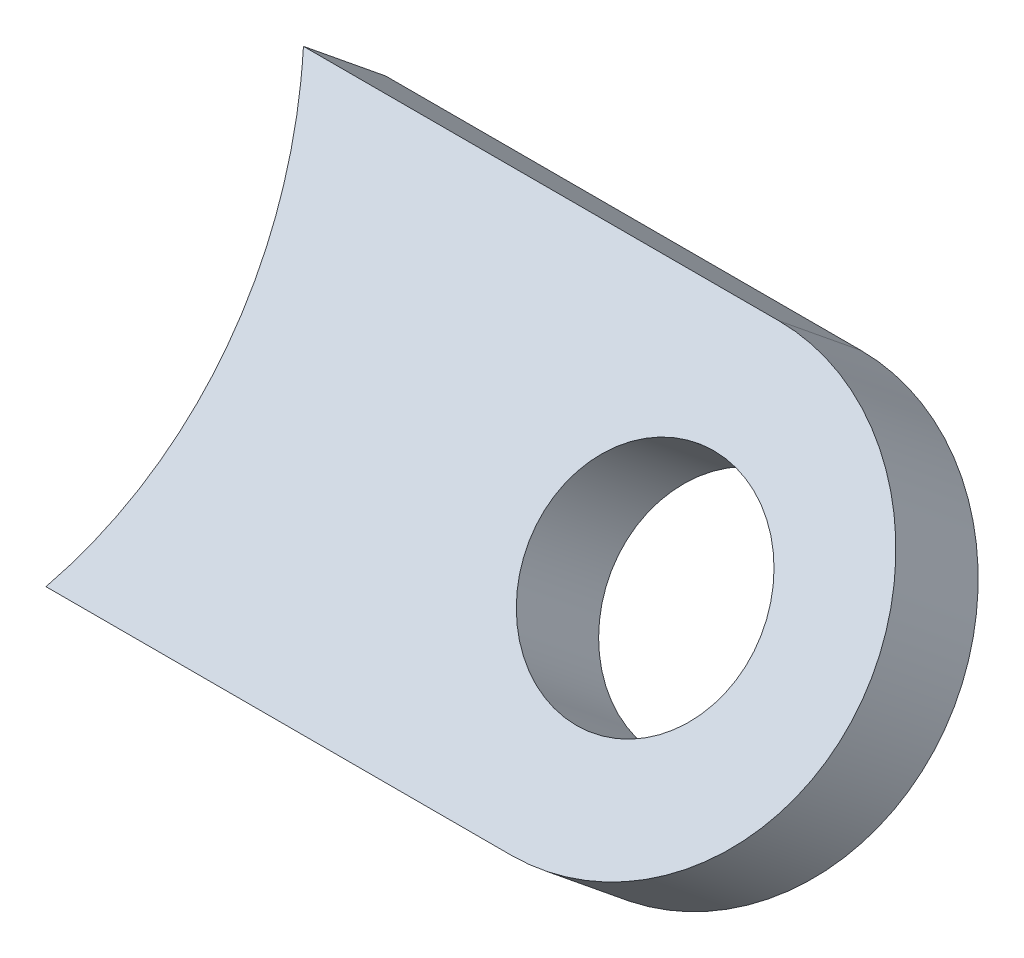
ISO-10303-21;
HEADER;
FILE_DESCRIPTION(('STEP AP214'),'2;1');
FILE_NAME('part.step','',(''),(''),'','','');
FILE_SCHEMA(('AUTOMOTIVE_DESIGN { 1 0 10303 214 1 1 1 1 }'));
ENDSEC;
DATA;
#1=APPLICATION_CONTEXT('core data for automotive mechanical design processes');
#2=APPLICATION_PROTOCOL_DEFINITION('international standard','automotive_design',2000,#1);
#3=PRODUCT_CONTEXT('',#1,'mechanical');
#4=PRODUCT('Part','Part','',(#3));
#5=PRODUCT_RELATED_PRODUCT_CATEGORY('part','',(#4));
#6=PRODUCT_DEFINITION_FORMATION('','',#4);
#7=PRODUCT_DEFINITION_CONTEXT('part definition',#1,'design');
#8=PRODUCT_DEFINITION('design','',#6,#7);
#9=PRODUCT_DEFINITION_SHAPE('','',#8);
#10=(LENGTH_UNIT() NAMED_UNIT(*) SI_UNIT(.MILLI.,.METRE.));
#11=(NAMED_UNIT(*) PLANE_ANGLE_UNIT() SI_UNIT($,.RADIAN.));
#12=(NAMED_UNIT(*) SI_UNIT($,.STERADIAN.) SOLID_ANGLE_UNIT());
#13=UNCERTAINTY_MEASURE_WITH_UNIT(LENGTH_MEASURE(1.E-05),#10,'distance_accuracy_value','');
#14=(GEOMETRIC_REPRESENTATION_CONTEXT(3) GLOBAL_UNCERTAINTY_ASSIGNED_CONTEXT((#13)) GLOBAL_UNIT_ASSIGNED_CONTEXT((#10,
#11,#12)) REPRESENTATION_CONTEXT('',''));
#15=CARTESIAN_POINT('',(0.,0.,0.));
#16=DIRECTION('',(0.,0.,1.));
#17=DIRECTION('',(1.,0.,0.));
#18=AXIS2_PLACEMENT_3D('',#15,#16,#17);
#19=CARTESIAN_POINT('',(-294.732924885388,114.1426530369,129.150880803748));
#20=DIRECTION('',(0.,-0.630511996261592,-0.776179504090531));
#21=DIRECTION('',(0.,0.776179504090531,-0.630511996261592));
#22=AXIS2_PLACEMENT_3D('',#19,#20,#21);
#23=PLANE('',#22);
#24=CARTESIAN_POINT('',(-294.732924885388,114.1426530369,129.150880803748));
#25=DIRECTION('',(0.,-0.630511996261592,-0.776179504090531));
#26=DIRECTION('',(0.,0.776179504090531,-0.630511996261592));
#27=AXIS2_PLACEMENT_3D('',#24,#25,#26);
#28=CIRCLE('',#27,3.2639);
#29=CARTESIAN_POINT('',(-294.732924885388,111.609280753499,131.208808908347));
#30=VERTEX_POINT('',#29);
#31=EDGE_CURVE('E110',#30,#30,#28,.T.);
#32=ORIENTED_EDGE('',*,*,#31,.F.);
#33=EDGE_LOOP('',(#32));
#34=FACE_BOUND('',#33,.T.);
#35=CARTESIAN_POINT('',(-308.697428246937,109.169189051724,133.190962626448));
#36=CARTESIAN_POINT('',(-308.198897948485,109.929215645387,132.573572084368));
#37=CARTESIAN_POINT('',(-307.448369839859,111.548575031029,131.258121839257));
#38=CARTESIAN_POINT('',(-307.118057965097,114.145424951657,129.14862910102));
#39=CARTESIAN_POINT('',(-307.606846343284,116.739727530974,127.041205638315));
#40=CARTESIAN_POINT('',(-308.459304269677,118.362564533561,125.722930429144));
#41=CARTESIAN_POINT('',(-309.002153819051,119.119344620465,125.108177113951));
#42=B_SPLINE_CURVE_WITH_KNOTS('',3,(#35,#36,#37,#38,#39,#40,#41),.UNSPECIFIED.,.F.,.F.,(4,1,1,1,
4),(0.751630578301676,1.00320690955254,1.25478324080341,1.50635957205427,1.75793590330514),.UNSPECIFIED.);
#43=CARTESIAN_POINT('',(-308.945663018633,119.039795742975,125.172796858845));
#44=VERTEX_POINT('',#43);
#45=CARTESIAN_POINT('',(-308.66827136486,109.213913185925,133.15463198001));
#46=VERTEX_POINT('',#45);
#47=EDGE_CURVE('E127',#44,#46,#42,.F.);
#48=ORIENTED_EDGE('',*,*,#47,.F.);
#49=CARTESIAN_POINT('',(-320.429388230365,114.818610003164,128.601782336268));
#50=DIRECTION('',(0.,-0.630511996261592,-0.776179504090531));
#51=DIRECTION('',(0.322258479400884,-0.734771659901167,0.596875263568791));
#52=AXIS2_PLACEMENT_3D('',#49,#50,#51);
#53=ELLIPSE('',#52,13.2223704151082,12.7);
#54=CARTESIAN_POINT('',(-308.964586854196,119.071392887875,125.147129627487));
#55=VERTEX_POINT('',#54);
#56=EDGE_CURVE('E121',#55,#44,#53,.T.);
#57=ORIENTED_EDGE('',*,*,#56,.F.);
#58=DIRECTION('',(1.,0.,0.));
#59=VECTOR('',#58,1.);
#60=CARTESIAN_POINT('',(-320.132924885388,119.071392887875,125.147129627487));
#61=LINE('',#60,#59);
#62=CARTESIAN_POINT('',(-294.732924885388,119.071392887875,125.147129627487));
#63=VERTEX_POINT('',#62);
#64=EDGE_CURVE('E105',#55,#63,#61,.T.);
#65=ORIENTED_EDGE('',*,*,#64,.T.);
#66=CARTESIAN_POINT('',(-294.732924885388,114.1426530369,129.150880803748));
#67=DIRECTION('',(0.,-0.630511996261592,-0.776179504090531));
#68=DIRECTION('',(0.,0.776179504090531,-0.630511996261592));
#69=AXIS2_PLACEMENT_3D('',#66,#67,#68);
#70=CIRCLE('',#69,6.34999999999999);
#71=CARTESIAN_POINT('',(-294.732924885388,109.213913185925,133.15463198001));
#72=VERTEX_POINT('',#71);
#73=EDGE_CURVE('E70',#63,#72,#70,.T.);
#74=ORIENTED_EDGE('',*,*,#73,.T.);
#75=DIRECTION('',(-1.,0.,0.));
#76=VECTOR('',#75,1.);
#77=CARTESIAN_POINT('',(-294.732924885388,109.213913185925,133.15463198001));
#78=LINE('',#77,#76);
#79=EDGE_CURVE('E100',#72,#46,#78,.T.);
#80=ORIENTED_EDGE('',*,*,#79,.T.);
#81=EDGE_LOOP('',(#48,#57,#65,#74,#80));
#82=FACE_BOUND('',#81,.T.);
#83=ADVANCED_FACE('F41',(#34,#82),#23,.T.);
#84=CARTESIAN_POINT('',(-294.732924885388,116.14452862503,131.615250729236));
#85=DIRECTION('',(0.,-0.630511996261592,-0.776179504090531));
#86=DIRECTION('',(0.,0.776179504090531,-0.630511996261592));
#87=AXIS2_PLACEMENT_3D('',#84,#85,#86);
#88=PLANE('',#87);
#89=CARTESIAN_POINT('',(-294.732924885388,116.14452862503,131.615250729236));
#90=DIRECTION('',(0.,-0.630511996261592,-0.776179504090531));
#91=DIRECTION('',(0.,0.776179504090531,-0.630511996261592));
#92=AXIS2_PLACEMENT_3D('',#89,#90,#91);
#93=CIRCLE('',#92,3.2639);
#94=CARTESIAN_POINT('',(-294.732924885388,113.611156341629,133.673178833834));
#95=VERTEX_POINT('',#94);
#96=EDGE_CURVE('E113',#95,#95,#93,.T.);
#97=ORIENTED_EDGE('',*,*,#96,.T.);
#98=EDGE_LOOP('',(#97));
#99=FACE_BOUND('',#98,.T.);
#100=DIRECTION('',(1.,0.,0.));
#101=VECTOR('',#100,1.);
#102=CARTESIAN_POINT('',(-320.132924885388,121.073268476005,127.611499552975));
#103=LINE('',#102,#101);
#104=CARTESIAN_POINT('',(-308.967965174706,121.073268476005,127.611499552975));
#105=VERTEX_POINT('',#104);
#106=CARTESIAN_POINT('',(-294.732924885388,121.073268476005,127.611499552975));
#107=VERTEX_POINT('',#106);
#108=EDGE_CURVE('E93',#105,#107,#103,.T.);
#109=ORIENTED_EDGE('',*,*,#108,.F.);
#110=CARTESIAN_POINT('',(-308.697428246937,111.171064639855,135.655332551936));
#111=CARTESIAN_POINT('',(-308.198897948485,111.931091233518,135.037942009855));
#112=CARTESIAN_POINT('',(-307.448369839859,113.55045061916,133.722491764744));
#113=CARTESIAN_POINT('',(-307.118057965097,116.147300539787,131.612999026508));
#114=CARTESIAN_POINT('',(-307.606846343284,118.741603119104,129.505575563802));
#115=CARTESIAN_POINT('',(-308.459304269677,120.364440121692,128.187300354632));
#116=CARTESIAN_POINT('',(-309.002153819051,121.121220208595,127.572547039439));
#117=B_SPLINE_CURVE_WITH_KNOTS('',3,(#110,#111,#112,#113,#114,#115,#116),.UNSPECIFIED.,.F.,.F.,
(4,1,1,1,4),(0.751630578301676,1.00320690955254,1.25478324080341,1.50635957205427,
1.75793590330514),.UNSPECIFIED.);
#118=CARTESIAN_POINT('',(-308.66827136486,111.215788774056,135.619001905497));
#119=VERTEX_POINT('',#118);
#120=EDGE_CURVE('E104',#105,#119,#117,.F.);
#121=ORIENTED_EDGE('',*,*,#120,.T.);
#122=DIRECTION('',(-1.,0.,0.));
#123=VECTOR('',#122,1.);
#124=CARTESIAN_POINT('',(-294.732924885388,111.215788774056,135.619001905497));
#125=LINE('',#124,#123);
#126=CARTESIAN_POINT('',(-294.732924885388,111.215788774056,135.619001905497));
#127=VERTEX_POINT('',#126);
#128=EDGE_CURVE('E92',#127,#119,#125,.T.);
#129=ORIENTED_EDGE('',*,*,#128,.F.);
#130=CARTESIAN_POINT('',(-294.732924885388,116.14452862503,131.615250729236));
#131=DIRECTION('',(0.,-0.630511996261592,-0.776179504090531));
#132=DIRECTION('',(0.,0.776179504090531,-0.630511996261592));
#133=AXIS2_PLACEMENT_3D('',#130,#131,#132);
#134=CIRCLE('',#133,6.34999999999999);
#135=EDGE_CURVE('E83',#107,#127,#134,.T.);
#136=ORIENTED_EDGE('',*,*,#135,.F.);
#137=EDGE_LOOP('',(#109,#121,#129,#136));
#138=FACE_BOUND('',#137,.T.);
#139=ADVANCED_FACE('F103',(#99,#138),#88,.F.);
#140=CARTESIAN_POINT('',(-320.132924885388,119.071392887875,125.147129627487));
#141=DIRECTION('',(0.,-0.776179504090531,0.630511996261592));
#142=DIRECTION('',(0.,-0.630511996261592,-0.776179504090531));
#143=AXIS2_PLACEMENT_3D('',#140,#141,#142);
#144=PLANE('',#143);
#145=CARTESIAN_POINT('',(-322.294587203653,106.476593716596,109.642547584885));
#146=DIRECTION('',(0.,-0.776179504090531,0.630511996261592));
#147=DIRECTION('',(0.0929698706276093,0.627781199916778,0.772817810474458));
#148=AXIS2_PLACEMENT_3D('',#145,#146,#147);
#149=ELLIPSE('',#148,48.2054533363894,12.7);
#150=CARTESIAN_POINT('',(-308.967965174706,119.132193620584,125.221977184461));
#151=VERTEX_POINT('',#150);
#152=EDGE_CURVE('E116',#55,#151,#149,.T.);
#153=ORIENTED_EDGE('',*,*,#152,.T.);
#154=DIRECTION('',(0.,0.630511996261592,0.776179504090531));
#155=VECTOR('',#154,1.);
#156=CARTESIAN_POINT('',(-308.967965174706,115.152597399257,120.322972819968));
#157=LINE('',#156,#155);
#158=EDGE_CURVE('E62',#151,#105,#157,.T.);
#159=ORIENTED_EDGE('',*,*,#158,.T.);
#160=ORIENTED_EDGE('',*,*,#108,.T.);
#161=DIRECTION('',(0.,0.630511996261592,0.776179504090531));
#162=VECTOR('',#161,1.);
#163=CARTESIAN_POINT('',(-294.732924885388,119.071392887875,125.147129627487));
#164=LINE('',#163,#162);
#165=EDGE_CURVE('E55',#63,#107,#164,.T.);
#166=ORIENTED_EDGE('',*,*,#165,.F.);
#167=ORIENTED_EDGE('',*,*,#64,.F.);
#168=EDGE_LOOP('',(#153,#159,#160,#166,#167));
#169=FACE_BOUND('',#168,.T.);
#170=ADVANCED_FACE('F43',(#169),#144,.F.);
#171=CARTESIAN_POINT('',(-294.732924885388,109.213913185925,133.15463198001));
#172=DIRECTION('',(0.,0.776179504090531,-0.630511996261592));
#173=DIRECTION('',(0.,0.630511996261592,0.776179504090531));
#174=AXIS2_PLACEMENT_3D('',#171,#172,#173);
#175=PLANE('',#174);
#176=ORIENTED_EDGE('',*,*,#128,.T.);
#177=DIRECTION('',(0.,0.630511996261592,0.776179504090531));
#178=VECTOR('',#177,1.);
#179=CARTESIAN_POINT('',(-308.66827136486,105.295117697307,128.330475172491));
#180=LINE('',#179,#178);
#181=EDGE_CURVE('E135',#46,#119,#180,.T.);
#182=ORIENTED_EDGE('',*,*,#181,.F.);
#183=ORIENTED_EDGE('',*,*,#79,.F.);
#184=DIRECTION('',(0.,0.630511996261592,0.776179504090531));
#185=VECTOR('',#184,1.);
#186=CARTESIAN_POINT('',(-294.732924885388,109.213913185925,133.15463198001));
#187=LINE('',#186,#185);
#188=EDGE_CURVE('E86',#72,#127,#187,.T.);
#189=ORIENTED_EDGE('',*,*,#188,.T.);
#190=EDGE_LOOP('',(#176,#182,#183,#189));
#191=FACE_BOUND('',#190,.T.);
#192=ADVANCED_FACE('F97',(#191),#175,.F.);
#193=CARTESIAN_POINT('',(-320.911078400438,112.664272958496,123.705534191892));
#194=DIRECTION('',(0.0896853848953909,0.401113742919049,0.911627279636605));
#195=DIRECTION('',(0.,-0.915315868946413,0.402736713070554));
#196=AXIS2_PLACEMENT_3D('',#193,#194,#195);
#197=CYLINDRICAL_SURFACE('',#196,12.7);
#198=ORIENTED_EDGE('',*,*,#56,.T.);
#199=CARTESIAN_POINT('',(-308.93255987357,118.982779914305,125.140784871694));
#200=CARTESIAN_POINT('',(-308.938115182955,119.007440307986,125.154912772587));
#201=CARTESIAN_POINT('',(-308.943843279718,119.032221649973,125.168742752202));
#202=CARTESIAN_POINT('',(-308.955645048001,119.082026230557,125.195806868878));
#203=CARTESIAN_POINT('',(-308.96171871952,119.107049469154,125.209041005938));
#204=CARTESIAN_POINT('',(-308.967965178418,119.132193656057,125.221977221721));
#205=B_SPLINE_CURVE_WITH_KNOTS('',3,(#199,#200,#201,#202,#203,#204),.UNSPECIFIED.,.F.,.F.,(4,2,
4),(0.,0.0868547583849588,0.173709516769936),.UNSPECIFIED.);
#206=EDGE_CURVE('E11',#44,#151,#205,.T.);
#207=ORIENTED_EDGE('',*,*,#206,.T.);
#208=ORIENTED_EDGE('',*,*,#152,.F.);
#209=EDGE_LOOP('',(#198,#207,#208));
#210=FACE_BOUND('',#209,.T.);
#211=ADVANCED_FACE('F152',(#210),#197,.F.);
#212=CARTESIAN_POINT('',(-294.732924885388,114.1426530369,129.150880803748));
#213=DIRECTION('',(0.,0.630511996261592,0.776179504090531));
#214=DIRECTION('',(0.,-0.776179504090531,0.630511996261592));
#215=AXIS2_PLACEMENT_3D('',#212,#213,#214);
#216=CYLINDRICAL_SURFACE('',#215,6.34999999999999);
#217=ORIENTED_EDGE('',*,*,#135,.T.);
#218=ORIENTED_EDGE('',*,*,#188,.F.);
#219=ORIENTED_EDGE('',*,*,#73,.F.);
#220=ORIENTED_EDGE('',*,*,#165,.T.);
#221=EDGE_LOOP('',(#217,#218,#219,#220));
#222=FACE_BOUND('',#221,.T.);
#223=ADVANCED_FACE('F85',(#222),#216,.T.);
#224=CARTESIAN_POINT('',(-294.732924885388,114.1426530369,129.150880803748));
#225=DIRECTION('',(0.,0.630511996261592,0.776179504090531));
#226=DIRECTION('',(0.,-0.776179504090531,0.630511996261592));
#227=AXIS2_PLACEMENT_3D('',#224,#225,#226);
#228=CYLINDRICAL_SURFACE('',#227,3.2639);
#229=CARTESIAN_POINT('',(-294.732924885388,111.609280753499,131.208808908347));
#230=CARTESIAN_POINT('',(-294.732924885388,111.630133624209,131.234479428404));
#231=CARTESIAN_POINT('',(-294.732924885388,111.650986494918,131.260149948461));
#232=CARTESIAN_POINT('',(-294.732924885388,111.692692236338,131.311490988575));
#233=CARTESIAN_POINT('',(-294.732924885388,111.713545107047,131.337161508632));
#234=CARTESIAN_POINT('',(-294.732924885388,111.755250848467,131.388502548747));
#235=CARTESIAN_POINT('',(-294.732924885388,111.776103719176,131.414173068804));
#236=CARTESIAN_POINT('',(-294.732924885388,111.817809460596,131.465514108918));
#237=CARTESIAN_POINT('',(-294.732924885388,111.838662331305,131.491184628975));
#238=CARTESIAN_POINT('',(-294.732924885388,111.880368072725,131.54252566909));
#239=CARTESIAN_POINT('',(-294.732924885388,111.901220943435,131.568196189147));
#240=CARTESIAN_POINT('',(-294.732924885388,111.942926684854,131.619537229261));
#241=CARTESIAN_POINT('',(-294.732924885388,111.963779555564,131.645207749318));
#242=CARTESIAN_POINT('',(-294.732924885388,112.005485296983,131.696548789433));
#243=CARTESIAN_POINT('',(-294.732924885388,112.026338167693,131.72221930949));
#244=CARTESIAN_POINT('',(-294.732924885388,112.068043909112,131.773560349604));
#245=CARTESIAN_POINT('',(-294.732924885388,112.088896779822,131.799230869661));
#246=CARTESIAN_POINT('',(-294.732924885388,112.130602521241,131.850571909776));
#247=CARTESIAN_POINT('',(-294.732924885388,112.151455391951,131.876242429833));
#248=CARTESIAN_POINT('',(-294.732924885388,112.19316113337,131.927583469947));
#249=CARTESIAN_POINT('',(-294.732924885388,112.21401400408,131.953253990004));
#250=CARTESIAN_POINT('',(-294.732924885388,112.255719745499,132.004595030119));
#251=CARTESIAN_POINT('',(-294.732924885388,112.276572616209,132.030265550176));
#252=CARTESIAN_POINT('',(-294.732924885388,112.318278357628,132.08160659029));
#253=CARTESIAN_POINT('',(-294.732924885388,112.339131228338,132.107277110347));
#254=CARTESIAN_POINT('',(-294.732924885388,112.380836969757,132.158618150462));
#255=CARTESIAN_POINT('',(-294.732924885388,112.401689840467,132.184288670519));
#256=CARTESIAN_POINT('',(-294.732924885388,112.443395581887,132.235629710633));
#257=CARTESIAN_POINT('',(-294.732924885388,112.464248452596,132.26130023069));
#258=CARTESIAN_POINT('',(-294.732924885388,112.505954194016,132.312641270805));
#259=CARTESIAN_POINT('',(-294.732924885388,112.526807064725,132.338311790862));
#260=CARTESIAN_POINT('',(-294.732924885388,112.568512806145,132.389652830976));
#261=CARTESIAN_POINT('',(-294.732924885388,112.589365676854,132.415323351033));
#262=CARTESIAN_POINT('',(-294.732924885388,112.631071418274,132.466664391148));
#263=CARTESIAN_POINT('',(-294.732924885388,112.651924288984,132.492334911205));
#264=CARTESIAN_POINT('',(-294.732924885388,112.693630030403,132.543675951319));
#265=CARTESIAN_POINT('',(-294.732924885388,112.714482901113,132.569346471376));
#266=CARTESIAN_POINT('',(-294.732924885388,112.756188642532,132.620687511491));
#267=CARTESIAN_POINT('',(-294.732924885388,112.777041513242,132.646358031548));
#268=CARTESIAN_POINT('',(-294.732924885388,112.818747254661,132.697699071662));
#269=CARTESIAN_POINT('',(-294.732924885388,112.839600125371,132.723369591719));
#270=CARTESIAN_POINT('',(-294.732924885388,112.88130586679,132.774710631833));
#271=CARTESIAN_POINT('',(-294.732924885388,112.9021587375,132.800381151891));
#272=CARTESIAN_POINT('',(-294.732924885388,112.943864478919,132.851722192005));
#273=CARTESIAN_POINT('',(-294.732924885388,112.964717349629,132.877392712062));
#274=CARTESIAN_POINT('',(-294.732924885388,113.006423091048,132.928733752176));
#275=CARTESIAN_POINT('',(-294.732924885388,113.027275961758,132.954404272234));
#276=CARTESIAN_POINT('',(-294.732924885388,113.068981703177,133.005745312348));
#277=CARTESIAN_POINT('',(-294.732924885388,113.089834573887,133.031415832405));
#278=CARTESIAN_POINT('',(-294.732924885388,113.131540315306,133.082756872519));
#279=CARTESIAN_POINT('',(-294.732924885388,113.152393186016,133.108427392577));
#280=CARTESIAN_POINT('',(-294.732924885388,113.194098927436,133.159768432691));
#281=CARTESIAN_POINT('',(-294.732924885388,113.214951798145,133.185438952748));
#282=CARTESIAN_POINT('',(-294.732924885388,113.256657539565,133.236779992862));
#283=CARTESIAN_POINT('',(-294.732924885388,113.277510410274,133.26245051292));
#284=CARTESIAN_POINT('',(-294.732924885388,113.319216151694,133.313791553034));
#285=CARTESIAN_POINT('',(-294.732924885388,113.340069022403,133.339462073091));
#286=CARTESIAN_POINT('',(-294.732924885388,113.381774763823,133.390803113205));
#287=CARTESIAN_POINT('',(-294.732924885388,113.402627634532,133.416473633262));
#288=CARTESIAN_POINT('',(-294.732924885388,113.444333375952,133.467814673377));
#289=CARTESIAN_POINT('',(-294.732924885388,113.465186246662,133.493485193434));
#290=CARTESIAN_POINT('',(-294.732924885388,113.506891988081,133.544826233548));
#291=CARTESIAN_POINT('',(-294.732924885388,113.527744858791,133.570496753605));
#292=CARTESIAN_POINT('',(-294.732924885388,113.56945060021,133.62183779372));
#293=CARTESIAN_POINT('',(-294.732924885388,113.59030347092,133.647508313777));
#294=CARTESIAN_POINT('',(-294.732924885388,113.611156341629,133.673178833834));
#295=B_SPLINE_CURVE_WITH_KNOTS('',3,(#229,#230,#231,#232,#233,#234,#235,#236,#237,#238,#239,
#240,#241,#242,#243,#244,#245,#246,#247,#248,#249,#250,#251,#252,#253,#254,#255,#256,#257,#258,
#259,#260,#261,#262,#263,#264,#265,#266,#267,#268,#269,#270,#271,#272,#273,#274,#275,#276,#277,
#278,#279,#280,#281,#282,#283,#284,#285,#286,#287,#288,#289,#290,#291,#292,#293,#294),
.UNSPECIFIED.,.F.,.F.,(4,2,2,2,2,2,2,2,2,2,2,2,2,2,2,2,2,2,2,2,2,2,2,2,2,2,2,2,2,2,2,2,4),(0.,
0.0992187499999948,0.19843749999999,0.297656250000015,0.396875000000009,0.496093750000013,
0.595312500000008,0.694531250000011,0.793750000000006,0.892968750000001,0.992187500000005,
1.09140625,1.190625,1.28984375,1.3890625,1.48828125,1.58749999999999,1.68671874999999,
1.78593750000001,1.88515625000001,1.98437500000001,2.08359375000001,2.18281250000001,2.28203125,
2.38125000000001,2.48046875,2.5796875,2.67890625,2.778125,2.87734375,2.97656249999999,
3.07578124999999,3.17500000000001),.UNSPECIFIED.);
#296=EDGE_CURVE('BSEAM151',#30,#95,#295,.T.);
#297=ORIENTED_EDGE('',*,*,#31,.T.);
#298=ORIENTED_EDGE('',*,*,#96,.F.);
#299=ORIENTED_EDGE('',*,*,#296,.T.);
#300=ORIENTED_EDGE('',*,*,#296,.F.);
#301=EDGE_LOOP('',(#297,#299,#298,#300));
#302=FACE_BOUND('',#301,.T.);
#303=ADVANCED_FACE('F151',(#302),#228,.F.);
#304=CARTESIAN_POINT('',(-308.697428246937,105.250393563106,128.366805818929));
#305=CARTESIAN_POINT('',(-308.198897948485,106.010420156769,127.749415276849));
#306=CARTESIAN_POINT('',(-307.448369839859,107.629779542411,126.433965031738));
#307=CARTESIAN_POINT('',(-307.118057965097,110.226629463039,124.324472293501));
#308=CARTESIAN_POINT('',(-307.606846343284,112.820932042356,122.217048830796));
#309=CARTESIAN_POINT('',(-308.459304269677,114.443769044943,120.898773621626));
#310=CARTESIAN_POINT('',(-309.002153819051,115.200549131847,120.284020306433));
#311=B_SPLINE_CURVE_WITH_KNOTS('',3,(#304,#305,#306,#307,#308,#309,#310),.UNSPECIFIED.,.F.,.F.,
(4,1,1,1,4),(0.751630578301676,1.00320690955254,1.25478324080341,1.50635957205427,
1.75793590330514),.UNSPECIFIED.);
#312=DIRECTION('',(0.,0.630511996261592,0.776179504090531));
#313=VECTOR('',#312,1.);
#314=SURFACE_OF_LINEAR_EXTRUSION('',#311,#313);
#315=ORIENTED_EDGE('',*,*,#120,.F.);
#316=ORIENTED_EDGE('',*,*,#158,.F.);
#317=ORIENTED_EDGE('',*,*,#206,.F.);
#318=ORIENTED_EDGE('',*,*,#47,.T.);
#319=ORIENTED_EDGE('',*,*,#181,.T.);
#320=EDGE_LOOP('',(#315,#316,#317,#318,#319));
#321=FACE_BOUND('',#320,.T.);
#322=ADVANCED_FACE('F148',(#321),#314,.F.);
#323=CLOSED_SHELL('',(#83,#139,#170,#192,#211,#223,#303,#322));
#324=MANIFOLD_SOLID_BREP('B2',#323);
#325=ADVANCED_BREP_SHAPE_REPRESENTATION('',(#18,#324),#14);
#326=SHAPE_DEFINITION_REPRESENTATION(#9,#325);
ENDSEC;
END-ISO-10303-21;
